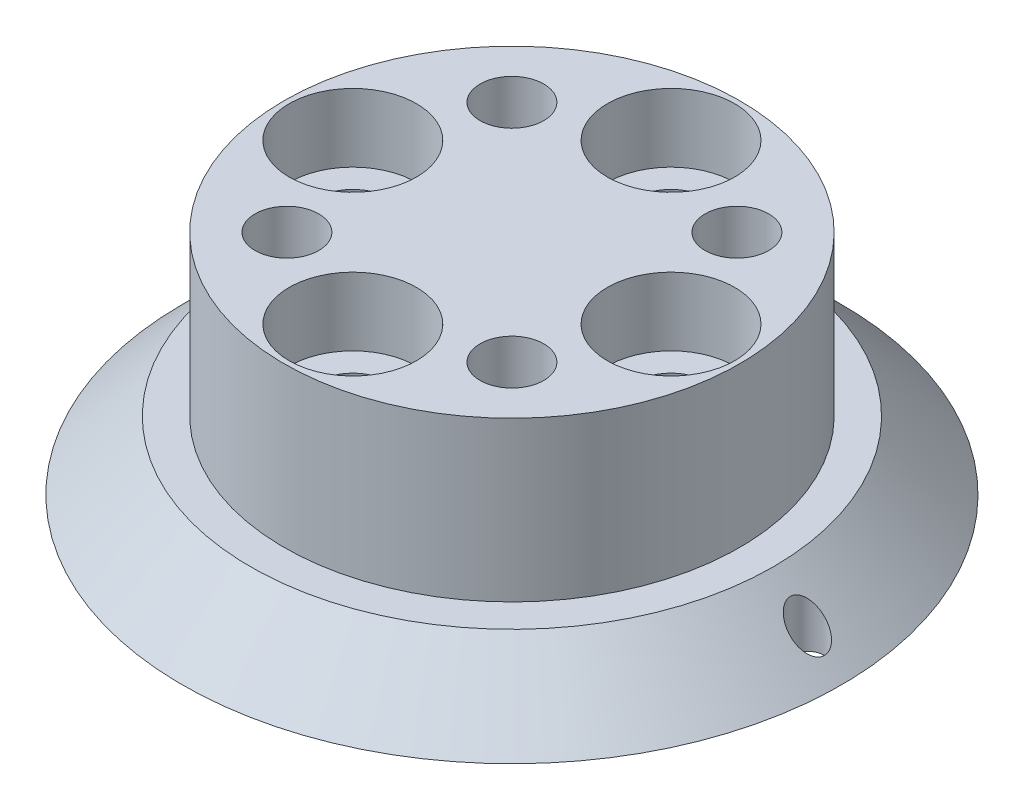
ISO-10303-21;
HEADER;
FILE_DESCRIPTION(('STEP AP214'),'2;1');
FILE_NAME('part.step','',(''),(''),'','','');
FILE_SCHEMA(('AUTOMOTIVE_DESIGN { 1 0 10303 214 1 1 1 1 }'));
ENDSEC;
DATA;
#1=APPLICATION_CONTEXT('core data for automotive mechanical design processes');
#2=APPLICATION_PROTOCOL_DEFINITION('international standard','automotive_design',2000,#1);
#3=PRODUCT_CONTEXT('',#1,'mechanical');
#4=PRODUCT('Part','Part','',(#3));
#5=PRODUCT_RELATED_PRODUCT_CATEGORY('part','',(#4));
#6=PRODUCT_DEFINITION_FORMATION('','',#4);
#7=PRODUCT_DEFINITION_CONTEXT('part definition',#1,'design');
#8=PRODUCT_DEFINITION('design','',#6,#7);
#9=PRODUCT_DEFINITION_SHAPE('','',#8);
#10=(LENGTH_UNIT() NAMED_UNIT(*) SI_UNIT(.MILLI.,.METRE.));
#11=(NAMED_UNIT(*) PLANE_ANGLE_UNIT() SI_UNIT($,.RADIAN.));
#12=(NAMED_UNIT(*) SI_UNIT($,.STERADIAN.) SOLID_ANGLE_UNIT());
#13=UNCERTAINTY_MEASURE_WITH_UNIT(LENGTH_MEASURE(1.E-05),#10,'distance_accuracy_value','');
#14=(GEOMETRIC_REPRESENTATION_CONTEXT(3) GLOBAL_UNCERTAINTY_ASSIGNED_CONTEXT((#13)) GLOBAL_UNIT_ASSIGNED_CONTEXT((#10,
#11,#12)) REPRESENTATION_CONTEXT('',''));
#15=CARTESIAN_POINT('',(0.,0.,0.));
#16=DIRECTION('',(0.,0.,1.));
#17=DIRECTION('',(1.,0.,0.));
#18=AXIS2_PLACEMENT_3D('',#15,#16,#17);
#19=CARTESIAN_POINT('',(0.,0.,0.));
#20=DIRECTION('',(0.,-1.,0.));
#21=DIRECTION('',(1.,0.,0.));
#22=AXIS2_PLACEMENT_3D('',#19,#20,#21);
#23=CONICAL_SURFACE('',#22,14.5,0.785398163397448);
#24=CARTESIAN_POINT('',(0.,3.,0.));
#25=DIRECTION('',(0.,1.,0.));
#26=DIRECTION('',(-1.,0.,0.));
#27=AXIS2_PLACEMENT_3D('',#24,#25,#26);
#28=CIRCLE('',#27,11.5);
#29=CARTESIAN_POINT('',(-11.5,3.,0.));
#30=VERTEX_POINT('',#29);
#31=EDGE_CURVE('E52',#30,#30,#28,.T.);
#32=ORIENTED_EDGE('',*,*,#31,.F.);
#33=EDGE_LOOP('',(#32));
#34=FACE_BOUND('',#33,.T.);
#35=CARTESIAN_POINT('',(0.,0.,0.));
#36=DIRECTION('',(0.,1.,0.));
#37=DIRECTION('',(-1.,0.,0.));
#38=AXIS2_PLACEMENT_3D('',#35,#36,#37);
#39=CIRCLE('',#38,14.5);
#40=CARTESIAN_POINT('',(-14.5,0.,0.));
#41=VERTEX_POINT('',#40);
#42=EDGE_CURVE('E10',#41,#41,#39,.T.);
#43=ORIENTED_EDGE('',*,*,#42,.T.);
#44=EDGE_LOOP('',(#43));
#45=FACE_BOUND('',#44,.T.);
#46=CARTESIAN_POINT('',(12.9948341608597,1.48354164212271,-0.749982209192976));
#47=CARTESIAN_POINT('',(12.9364935341536,1.54180922561021,-0.749583560756459));
#48=CARTESIAN_POINT('',(12.8783004941769,1.60032300226983,-0.742396161148481));
#49=CARTESIAN_POINT('',(12.7638365458904,1.71619736467733,-0.714289848122274));
#50=CARTESIAN_POINT('',(12.7075695409703,1.77355552163764,-0.693344607078417));
#51=CARTESIAN_POINT('',(12.6150955455572,1.86843105298747,-0.645141021105514));
#52=CARTESIAN_POINT('',(12.5778602982361,1.90681752631335,-0.621557567258396));
#53=CARTESIAN_POINT('',(12.5064901064853,1.9807110489241,-0.566544212082132));
#54=CARTESIAN_POINT('',(12.4723482257536,2.01622452020039,-0.535132489345172));
#55=CARTESIAN_POINT('',(12.4175658602599,2.07342393970432,-0.473771049948768));
#56=CARTESIAN_POINT('',(12.3958114770755,2.09620837855213,-0.445845053144497));
#57=CARTESIAN_POINT('',(12.3555956917519,2.13842926219778,-0.385428639563194));
#58=CARTESIAN_POINT('',(12.3371299376035,2.15787013052481,-0.352944358386047));
#59=CARTESIAN_POINT('',(12.3080993956197,2.18849042864441,-0.290999209487508));
#60=CARTESIAN_POINT('',(12.2966894632602,2.20054751962583,-0.262372822438794));
#61=CARTESIAN_POINT('',(12.2772535405381,2.22110761753119,-0.20277387183083));
#62=CARTESIAN_POINT('',(12.2692250052006,2.22961329734777,-0.171803093541556));
#63=CARTESIAN_POINT('',(12.2571011220467,2.24246468226432,-0.10799210400031));
#64=CARTESIAN_POINT('',(12.253035415884,2.24677903579229,-0.075139721345059));
#65=CARTESIAN_POINT('',(12.2493212253376,2.250720166486,-0.00891009643265465));
#66=CARTESIAN_POINT('',(12.2496704733824,2.25034935000936,0.0244668675958352));
#67=CARTESIAN_POINT('',(12.2544441442832,2.24528449682013,0.0866241621838291));
#68=CARTESIAN_POINT('',(12.2583882705096,2.24109999538888,0.115486387743772));
#69=CARTESIAN_POINT('',(12.269401034764,2.22942704096951,0.171908238249079));
#70=CARTESIAN_POINT('',(12.2764708128509,2.22193738245102,0.199467383841684));
#71=CARTESIAN_POINT('',(12.2956955969512,2.20159706546993,0.260263823595735));
#72=CARTESIAN_POINT('',(12.3087215905999,2.1878310717698,0.292918145290884));
#73=CARTESIAN_POINT('',(12.3382852534755,2.1566552265864,0.354700212425162));
#74=CARTESIAN_POINT('',(12.3548289691708,2.139239101791,0.383821748389245));
#75=CARTESIAN_POINT('',(12.3973109610119,2.09462831737477,0.448641474065824));
#76=CARTESIAN_POINT('',(12.4244458681322,2.06621570718072,0.482711355779163));
#77=CARTESIAN_POINT('',(12.4821947286028,2.0059823230508,0.544208911392021));
#78=CARTESIAN_POINT('',(12.5128150121732,1.97415535410635,0.571624206936969));
#79=CARTESIAN_POINT('',(12.5890303907577,1.89526320863927,0.629861953453657));
#80=CARTESIAN_POINT('',(12.6357657883682,1.84714175277602,0.657758271820858));
#81=CARTESIAN_POINT('',(12.7320017535624,1.74864772687644,0.702492486529439));
#82=CARTESIAN_POINT('',(12.7815050130463,1.69827297524969,0.719319406912173));
#83=CARTESIAN_POINT('',(12.8831897526105,1.59542178273262,0.742724299936907));
#84=CARTESIAN_POINT('',(12.9354068728255,1.54292380313453,0.749050848465239));
#85=CARTESIAN_POINT('',(13.0402496000027,1.43815737678019,0.750751602803753));
#86=CARTESIAN_POINT('',(13.0928751559745,1.38588890260797,0.746127154527306));
#87=CARTESIAN_POINT('',(13.19415891612,1.28587946082146,0.726157335679848));
#88=CARTESIAN_POINT('',(13.2428648640824,1.23805563919978,0.711475896782998));
#89=CARTESIAN_POINT('',(13.3382410027694,1.14489146078698,0.671389238050788));
#90=CARTESIAN_POINT('',(13.3849136371072,1.09954810523978,0.645997305490776));
#91=CARTESIAN_POINT('',(13.4616176730238,1.02537474030644,0.592398064994469));
#92=CARTESIAN_POINT('',(13.492620140706,0.995503368127729,0.567021893026735));
#93=CARTESIAN_POINT('',(13.5515215141515,0.938921336608146,0.509903460497264));
#94=CARTESIAN_POINT('',(13.5794248214808,0.912206191124143,0.478170412724067));
#95=CARTESIAN_POINT('',(13.624912500746,0.868764263544569,0.416070337253262));
#96=CARTESIAN_POINT('',(13.6434063856979,0.851142229083931,0.387000374067114));
#97=CARTESIAN_POINT('',(13.6767844829109,0.819387868123951,0.325106415936343));
#98=CARTESIAN_POINT('',(13.691673003496,0.805251376113521,0.292286971281323));
#99=CARTESIAN_POINT('',(13.7148932682379,0.7832282477634,0.228869975845452));
#100=CARTESIAN_POINT('',(13.7238885897199,0.774707727111714,0.198737533158631));
#101=CARTESIAN_POINT('',(13.738097437305,0.761256272979814,0.136817021476729));
#102=CARTESIAN_POINT('',(13.7433130921196,0.756323318973499,0.105029895230728));
#103=CARTESIAN_POINT('',(13.7496039476048,0.750374113506902,0.0405679119815987));
#104=CARTESIAN_POINT('',(13.7506649916144,0.749371253666974,0.00789040112642758));
#105=CARTESIAN_POINT('',(13.7485244097244,0.751395141202121,-0.0571969821317426));
#106=CARTESIAN_POINT('',(13.7453227168843,0.75442195185771,-0.0896068503237343));
#107=CARTESIAN_POINT('',(13.7351828385351,0.764015336874811,-0.151445325885998));
#108=CARTESIAN_POINT('',(13.7284548852159,0.770382766175314,-0.180940523882739));
#109=CARTESIAN_POINT('',(13.7118089609947,0.786153166714391,-0.238153802516811));
#110=CARTESIAN_POINT('',(13.7018897593155,0.795557309135305,-0.265871192547562));
#111=CARTESIAN_POINT('',(13.6755467056619,0.820565895022131,-0.328067124879033));
#112=CARTESIAN_POINT('',(13.658057185053,0.837191908107657,-0.361684211095385));
#113=CARTESIAN_POINT('',(13.6193867479272,0.874035959088365,-0.424532691005327));
#114=CARTESIAN_POINT('',(13.5981995799411,0.894260081310036,-0.453756498857077));
#115=CARTESIAN_POINT('',(13.545381996071,0.944806690936942,-0.516998891662958));
#116=CARTESIAN_POINT('',(13.512659875584,0.976215710286605,-0.549232597869107));
#117=CARTESIAN_POINT('',(13.444053665074,1.04232576490471,-0.606059237602858));
#118=CARTESIAN_POINT('',(13.4081631032902,1.07703354974343,-0.63063604523612));
#119=CARTESIAN_POINT('',(13.3218388951049,1.16086172466466,-0.679824988455356));
#120=CARTESIAN_POINT('',(13.270627549972,1.21085340517382,-0.701577736521775));
#121=CARTESIAN_POINT('',(13.1667896406572,1.31282332478809,-0.733227549377035));
#122=CARTESIAN_POINT('',(13.1141652302391,1.36479858642158,-0.743141714100687));
#123=CARTESIAN_POINT('',(13.0392912029387,1.43919734430488,-0.749301264230677));
#124=CARTESIAN_POINT('',(13.0170519795783,1.46135164040038,-0.75013402618904));
#125=CARTESIAN_POINT('',(12.9948341608597,1.48354164212271,-0.749982209192976));
#126=B_SPLINE_CURVE_WITH_KNOTS('',3,(#46,#47,#48,#49,#50,#51,#52,#53,#54,#55,#56,#57,#58,#59,
#60,#61,#62,#63,#64,#65,#66,#67,#68,#69,#70,#71,#72,#73,#74,#75,#76,#77,#78,#79,#80,#81,#82,#83,
#84,#85,#86,#87,#88,#89,#90,#91,#92,#93,#94,#95,#96,#97,#98,#99,#100,#101,#102,#103,#104,#105,
#106,#107,#108,#109,#110,#111,#112,#113,#114,#115,#116,#117,#118,#119,#120,#121,#122,#123,#124,
#125),.UNSPECIFIED.,.T.,.F.,(4,2,2,2,2,2,2,2,2,2,2,2,2,2,2,2,2,2,2,2,2,2,2,2,2,2,2,2,2,2,2,2,2,
2,2,2,2,2,2,4),(0.,0.247285800719263,0.495046202775016,0.669853176637426,0.844257940494709,
0.97015057263341,1.09587534629085,1.19476631073188,1.29358271228266,1.39313270656967,
1.4926315729049,1.58051970288338,1.66843991590453,1.78108751229377,1.89393032226417,
2.04908428552146,2.20452467992398,2.42131705975766,2.63832407925603,2.86045594301618,
3.08256050745977,3.29125946234822,3.49970026645828,3.64914298228231,3.79837066303312,
3.9140460048945,4.02958242772126,4.12690864510879,4.22418000559957,4.32178252718911,
4.41938658151202,4.51174093024112,4.60413094030013,4.72759527806749,4.85127041087299,
5.01729578273769,5.18366848668893,5.40690958394362,5.62982783481875,5.72400150764742),.UNSPECIFIED.);
#127=CARTESIAN_POINT('',(12.9948341608597,1.48354164212271,-0.749982209192976));
#128=VERTEX_POINT('',#127);
#129=EDGE_CURVE('E43',#128,#128,#126,.T.);
#130=ORIENTED_EDGE('',*,*,#129,.F.);
#131=EDGE_LOOP('',(#130));
#132=FACE_BOUND('',#131,.T.);
#133=ADVANCED_FACE('F39',(#34,#45,#132),#23,.T.);
#134=CARTESIAN_POINT('',(10.025,10.,0.));
#135=DIRECTION('',(0.,-1.,0.));
#136=DIRECTION('',(1.,0.,0.));
#137=AXIS2_PLACEMENT_3D('',#134,#135,#136);
#138=PLANE('',#137);
#139=CARTESIAN_POINT('',(0.,10.,-7.));
#140=DIRECTION('',(0.,1.,0.));
#141=DIRECTION('',(0.,0.,1.));
#142=AXIS2_PLACEMENT_3D('',#139,#140,#141);
#143=CIRCLE('',#142,2.8);
#144=CARTESIAN_POINT('',(0.,10.,-4.2));
#145=VERTEX_POINT('',#144);
#146=EDGE_CURVE('E144',#145,#145,#143,.T.);
#147=ORIENTED_EDGE('',*,*,#146,.F.);
#148=EDGE_LOOP('',(#147));
#149=FACE_BOUND('',#148,.T.);
#150=CARTESIAN_POINT('',(-7.,10.,0.));
#151=DIRECTION('',(0.,1.,0.));
#152=DIRECTION('',(0.,0.,1.));
#153=AXIS2_PLACEMENT_3D('',#150,#151,#152);
#154=CIRCLE('',#153,2.8);
#155=CARTESIAN_POINT('',(-7.,10.,2.79999999999993));
#156=VERTEX_POINT('',#155);
#157=EDGE_CURVE('E132',#156,#156,#154,.T.);
#158=ORIENTED_EDGE('',*,*,#157,.F.);
#159=EDGE_LOOP('',(#158));
#160=FACE_BOUND('',#159,.T.);
#161=CARTESIAN_POINT('',(0.,10.,7.));
#162=DIRECTION('',(0.,1.,0.));
#163=DIRECTION('',(0.,0.,1.));
#164=AXIS2_PLACEMENT_3D('',#161,#162,#163);
#165=CIRCLE('',#164,2.8);
#166=CARTESIAN_POINT('',(0.,10.,9.8));
#167=VERTEX_POINT('',#166);
#168=EDGE_CURVE('E120',#167,#167,#165,.T.);
#169=ORIENTED_EDGE('',*,*,#168,.F.);
#170=EDGE_LOOP('',(#169));
#171=FACE_BOUND('',#170,.T.);
#172=CARTESIAN_POINT('',(0.,10.,0.));
#173=DIRECTION('',(0.,1.,0.));
#174=DIRECTION('',(-1.,0.,0.));
#175=AXIS2_PLACEMENT_3D('',#172,#173,#174);
#176=CIRCLE('',#175,10.025);
#177=CARTESIAN_POINT('',(-10.025,10.,0.));
#178=VERTEX_POINT('',#177);
#179=EDGE_CURVE('E64',#178,#178,#176,.T.);
#180=ORIENTED_EDGE('',*,*,#179,.T.);
#181=EDGE_LOOP('',(#180));
#182=FACE_BOUND('',#181,.T.);
#183=CARTESIAN_POINT('',(4.94974746830581,10.,4.94974746830586));
#184=DIRECTION('',(0.,1.,0.));
#185=DIRECTION('',(-1.,0.,0.));
#186=AXIS2_PLACEMENT_3D('',#183,#184,#185);
#187=CIRCLE('',#186,1.4);
#188=CARTESIAN_POINT('',(3.54974746830581,10.,4.94974746830586));
#189=VERTEX_POINT('',#188);
#190=EDGE_CURVE('E86',#189,#189,#187,.T.);
#191=ORIENTED_EDGE('',*,*,#190,.F.);
#192=EDGE_LOOP('',(#191));
#193=FACE_BOUND('',#192,.T.);
#194=CARTESIAN_POINT('',(4.94974746830591,10.,-4.94974746830576));
#195=DIRECTION('',(0.,1.,0.));
#196=DIRECTION('',(-1.,0.,0.));
#197=AXIS2_PLACEMENT_3D('',#194,#195,#196);
#198=CIRCLE('',#197,1.4);
#199=CARTESIAN_POINT('',(3.54974746830591,10.,-4.94974746830576));
#200=VERTEX_POINT('',#199);
#201=EDGE_CURVE('E68',#200,#200,#198,.T.);
#202=ORIENTED_EDGE('',*,*,#201,.F.);
#203=EDGE_LOOP('',(#202));
#204=FACE_BOUND('',#203,.T.);
#205=CARTESIAN_POINT('',(-4.94974746830588,10.,4.94974746830579));
#206=DIRECTION('',(0.,1.,0.));
#207=DIRECTION('',(-1.,0.,0.));
#208=AXIS2_PLACEMENT_3D('',#205,#206,#207);
#209=CIRCLE('',#208,1.4);
#210=CARTESIAN_POINT('',(-6.34974746830588,10.,4.94974746830579));
#211=VERTEX_POINT('',#210);
#212=EDGE_CURVE('E79',#211,#211,#209,.T.);
#213=ORIENTED_EDGE('',*,*,#212,.F.);
#214=EDGE_LOOP('',(#213));
#215=FACE_BOUND('',#214,.T.);
#216=CARTESIAN_POINT('',(-4.94974746830577,10.,-4.94974746830589));
#217=DIRECTION('',(0.,1.,0.));
#218=DIRECTION('',(-1.,0.,0.));
#219=AXIS2_PLACEMENT_3D('',#216,#217,#218);
#220=CIRCLE('',#219,1.4);
#221=CARTESIAN_POINT('',(-6.34974746830577,10.,-4.94974746830589));
#222=VERTEX_POINT('',#221);
#223=EDGE_CURVE('E72',#222,#222,#220,.T.);
#224=ORIENTED_EDGE('',*,*,#223,.F.);
#225=EDGE_LOOP('',(#224));
#226=FACE_BOUND('',#225,.T.);
#227=CARTESIAN_POINT('',(7.,10.,1.21843208143388E-13));
#228=DIRECTION('',(0.,1.,0.));
#229=DIRECTION('',(0.,0.,1.));
#230=AXIS2_PLACEMENT_3D('',#227,#228,#229);
#231=CIRCLE('',#230,2.8);
#232=CARTESIAN_POINT('',(7.,10.,2.80000000000012));
#233=VERTEX_POINT('',#232);
#234=EDGE_CURVE('E107',#233,#233,#231,.T.);
#235=ORIENTED_EDGE('',*,*,#234,.F.);
#236=EDGE_LOOP('',(#235));
#237=FACE_BOUND('',#236,.T.);
#238=ADVANCED_FACE('F158',(#149,#160,#171,#182,#193,#204,#215,#226,#237),#138,.F.);
#239=CARTESIAN_POINT('',(14.5,0.,0.));
#240=DIRECTION('',(0.,1.,0.));
#241=DIRECTION('',(-1.,0.,0.));
#242=AXIS2_PLACEMENT_3D('',#239,#240,#241);
#243=PLANE('',#242);
#244=CARTESIAN_POINT('',(13.,0.,0.));
#245=DIRECTION('',(0.,1.,0.));
#246=DIRECTION('',(0.,0.,1.));
#247=AXIS2_PLACEMENT_3D('',#244,#245,#246);
#248=CIRCLE('',#247,0.75);
#249=CARTESIAN_POINT('',(13.,0.,0.75));
#250=VERTEX_POINT('',#249);
#251=EDGE_CURVE('E147',#250,#250,#248,.T.);
#252=ORIENTED_EDGE('',*,*,#251,.T.);
#253=EDGE_LOOP('',(#252));
#254=FACE_BOUND('',#253,.T.);
#255=CARTESIAN_POINT('',(0.,0.,-7.));
#256=DIRECTION('',(0.,1.,0.));
#257=DIRECTION('',(0.,0.,1.));
#258=AXIS2_PLACEMENT_3D('',#255,#256,#257);
#259=CIRCLE('',#258,1.6);
#260=CARTESIAN_POINT('',(0.,0.,-5.4));
#261=VERTEX_POINT('',#260);
#262=EDGE_CURVE('E135',#261,#261,#259,.T.);
#263=ORIENTED_EDGE('',*,*,#262,.T.);
#264=EDGE_LOOP('',(#263));
#265=FACE_BOUND('',#264,.T.);
#266=CARTESIAN_POINT('',(-7.,0.,0.));
#267=DIRECTION('',(0.,1.,0.));
#268=DIRECTION('',(0.,0.,1.));
#269=AXIS2_PLACEMENT_3D('',#266,#267,#268);
#270=CIRCLE('',#269,1.6);
#271=CARTESIAN_POINT('',(-7.,0.,1.59999999999993));
#272=VERTEX_POINT('',#271);
#273=EDGE_CURVE('E123',#272,#272,#270,.T.);
#274=ORIENTED_EDGE('',*,*,#273,.T.);
#275=EDGE_LOOP('',(#274));
#276=FACE_BOUND('',#275,.T.);
#277=CARTESIAN_POINT('',(0.,0.,7.));
#278=DIRECTION('',(0.,1.,0.));
#279=DIRECTION('',(0.,0.,1.));
#280=AXIS2_PLACEMENT_3D('',#277,#278,#279);
#281=CIRCLE('',#280,1.6);
#282=CARTESIAN_POINT('',(0.,0.,8.6));
#283=VERTEX_POINT('',#282);
#284=EDGE_CURVE('E111',#283,#283,#281,.T.);
#285=ORIENTED_EDGE('',*,*,#284,.T.);
#286=EDGE_LOOP('',(#285));
#287=FACE_BOUND('',#286,.T.);
#288=CARTESIAN_POINT('',(7.,0.,1.21843208143388E-13));
#289=DIRECTION('',(0.,1.,0.));
#290=DIRECTION('',(0.,0.,1.));
#291=AXIS2_PLACEMENT_3D('',#288,#289,#290);
#292=CIRCLE('',#291,1.6);
#293=CARTESIAN_POINT('',(7.,0.,1.60000000000012));
#294=VERTEX_POINT('',#293);
#295=EDGE_CURVE('E73',#294,#294,#292,.T.);
#296=ORIENTED_EDGE('',*,*,#295,.T.);
#297=EDGE_LOOP('',(#296));
#298=FACE_BOUND('',#297,.T.);
#299=CARTESIAN_POINT('',(-4.94974746830577,0.,-4.94974746830589));
#300=DIRECTION('',(0.,1.,0.));
#301=DIRECTION('',(-1.,0.,0.));
#302=AXIS2_PLACEMENT_3D('',#299,#300,#301);
#303=CIRCLE('',#302,1.4);
#304=CARTESIAN_POINT('',(-6.34974746830577,0.,-4.94974746830589));
#305=VERTEX_POINT('',#304);
#306=EDGE_CURVE('E69',#305,#305,#303,.T.);
#307=ORIENTED_EDGE('',*,*,#306,.T.);
#308=EDGE_LOOP('',(#307));
#309=FACE_BOUND('',#308,.T.);
#310=CARTESIAN_POINT('',(-4.94974746830588,0.,4.94974746830579));
#311=DIRECTION('',(0.,1.,0.));
#312=DIRECTION('',(-1.,0.,0.));
#313=AXIS2_PLACEMENT_3D('',#310,#311,#312);
#314=CIRCLE('',#313,1.4);
#315=CARTESIAN_POINT('',(-6.34974746830588,0.,4.94974746830579));
#316=VERTEX_POINT('',#315);
#317=EDGE_CURVE('E76',#316,#316,#314,.T.);
#318=ORIENTED_EDGE('',*,*,#317,.T.);
#319=EDGE_LOOP('',(#318));
#320=FACE_BOUND('',#319,.T.);
#321=CARTESIAN_POINT('',(4.94974746830591,0.,-4.94974746830576));
#322=DIRECTION('',(0.,1.,0.));
#323=DIRECTION('',(-1.,0.,0.));
#324=AXIS2_PLACEMENT_3D('',#321,#322,#323);
#325=CIRCLE('',#324,1.4);
#326=CARTESIAN_POINT('',(3.54974746830591,0.,-4.94974746830576));
#327=VERTEX_POINT('',#326);
#328=EDGE_CURVE('E83',#327,#327,#325,.T.);
#329=ORIENTED_EDGE('',*,*,#328,.T.);
#330=EDGE_LOOP('',(#329));
#331=FACE_BOUND('',#330,.T.);
#332=CARTESIAN_POINT('',(4.94974746830581,0.,4.94974746830586));
#333=DIRECTION('',(0.,1.,0.));
#334=DIRECTION('',(-1.,0.,0.));
#335=AXIS2_PLACEMENT_3D('',#332,#333,#334);
#336=CIRCLE('',#335,1.4);
#337=CARTESIAN_POINT('',(3.54974746830581,0.,4.94974746830586));
#338=VERTEX_POINT('',#337);
#339=EDGE_CURVE('E82',#338,#338,#336,.T.);
#340=ORIENTED_EDGE('',*,*,#339,.T.);
#341=EDGE_LOOP('',(#340));
#342=FACE_BOUND('',#341,.T.);
#343=ORIENTED_EDGE('',*,*,#42,.F.);
#344=EDGE_LOOP('',(#343));
#345=FACE_BOUND('',#344,.T.);
#346=ADVANCED_FACE('F41',(#254,#265,#276,#287,#298,#309,#320,#331,#342,#345),#243,.F.);
#347=CARTESIAN_POINT('',(11.5,3.,0.));
#348=DIRECTION('',(0.,-1.,0.));
#349=DIRECTION('',(1.,0.,0.));
#350=AXIS2_PLACEMENT_3D('',#347,#348,#349);
#351=PLANE('',#350);
#352=CARTESIAN_POINT('',(0.,3.,0.));
#353=DIRECTION('',(0.,1.,0.));
#354=DIRECTION('',(-1.,0.,0.));
#355=AXIS2_PLACEMENT_3D('',#352,#353,#354);
#356=CIRCLE('',#355,10.025);
#357=CARTESIAN_POINT('',(-10.025,3.,0.));
#358=VERTEX_POINT('',#357);
#359=EDGE_CURVE('E58',#358,#358,#356,.T.);
#360=ORIENTED_EDGE('',*,*,#359,.F.);
#361=EDGE_LOOP('',(#360));
#362=FACE_BOUND('',#361,.T.);
#363=ORIENTED_EDGE('',*,*,#31,.T.);
#364=EDGE_LOOP('',(#363));
#365=FACE_BOUND('',#364,.T.);
#366=ADVANCED_FACE('F170',(#362,#365),#351,.F.);
#367=CARTESIAN_POINT('',(0.,10.,0.));
#368=DIRECTION('',(0.,1.,0.));
#369=DIRECTION('',(-1.,0.,0.));
#370=AXIS2_PLACEMENT_3D('',#367,#368,#369);
#371=CYLINDRICAL_SURFACE('',#370,10.025);
#372=ORIENTED_EDGE('',*,*,#179,.F.);
#373=EDGE_LOOP('',(#372));
#374=FACE_BOUND('',#373,.T.);
#375=ORIENTED_EDGE('',*,*,#359,.T.);
#376=EDGE_LOOP('',(#375));
#377=FACE_BOUND('',#376,.T.);
#378=ADVANCED_FACE('F173',(#374,#377),#371,.T.);
#379=CARTESIAN_POINT('',(4.94974746830581,0.,4.94974746830586));
#380=DIRECTION('',(0.,1.,0.));
#381=DIRECTION('',(-1.,0.,0.));
#382=AXIS2_PLACEMENT_3D('',#379,#380,#381);
#383=CYLINDRICAL_SURFACE('',#382,1.4);
#384=ORIENTED_EDGE('',*,*,#339,.F.);
#385=EDGE_LOOP('',(#384));
#386=FACE_BOUND('',#385,.T.);
#387=ORIENTED_EDGE('',*,*,#190,.T.);
#388=EDGE_LOOP('',(#387));
#389=FACE_BOUND('',#388,.T.);
#390=ADVANCED_FACE('F176',(#386,#389),#383,.F.);
#391=CARTESIAN_POINT('',(4.94974746830591,0.,-4.94974746830576));
#392=DIRECTION('',(0.,1.,0.));
#393=DIRECTION('',(-1.,0.,0.));
#394=AXIS2_PLACEMENT_3D('',#391,#392,#393);
#395=CYLINDRICAL_SURFACE('',#394,1.4);
#396=ORIENTED_EDGE('',*,*,#328,.F.);
#397=EDGE_LOOP('',(#396));
#398=FACE_BOUND('',#397,.T.);
#399=ORIENTED_EDGE('',*,*,#201,.T.);
#400=EDGE_LOOP('',(#399));
#401=FACE_BOUND('',#400,.T.);
#402=ADVANCED_FACE('F187',(#398,#401),#395,.F.);
#403=CARTESIAN_POINT('',(-4.94974746830588,0.,4.94974746830579));
#404=DIRECTION('',(0.,1.,0.));
#405=DIRECTION('',(-1.,0.,0.));
#406=AXIS2_PLACEMENT_3D('',#403,#404,#405);
#407=CYLINDRICAL_SURFACE('',#406,1.4);
#408=ORIENTED_EDGE('',*,*,#317,.F.);
#409=EDGE_LOOP('',(#408));
#410=FACE_BOUND('',#409,.T.);
#411=ORIENTED_EDGE('',*,*,#212,.T.);
#412=EDGE_LOOP('',(#411));
#413=FACE_BOUND('',#412,.T.);
#414=ADVANCED_FACE('F183',(#410,#413),#407,.F.);
#415=CARTESIAN_POINT('',(-4.94974746830577,0.,-4.94974746830589));
#416=DIRECTION('',(0.,1.,0.));
#417=DIRECTION('',(-1.,0.,0.));
#418=AXIS2_PLACEMENT_3D('',#415,#416,#417);
#419=CYLINDRICAL_SURFACE('',#418,1.4);
#420=ORIENTED_EDGE('',*,*,#306,.F.);
#421=EDGE_LOOP('',(#420));
#422=FACE_BOUND('',#421,.T.);
#423=ORIENTED_EDGE('',*,*,#223,.T.);
#424=EDGE_LOOP('',(#423));
#425=FACE_BOUND('',#424,.T.);
#426=ADVANCED_FACE('F179',(#422,#425),#419,.F.);
#427=CARTESIAN_POINT('',(7.,10.,1.21843208143388E-13));
#428=DIRECTION('',(0.,1.,0.));
#429=DIRECTION('',(0.,0.,1.));
#430=AXIS2_PLACEMENT_3D('',#427,#428,#429);
#431=CYLINDRICAL_SURFACE('',#430,1.6);
#432=ORIENTED_EDGE('',*,*,#295,.F.);
#433=EDGE_LOOP('',(#432));
#434=FACE_BOUND('',#433,.T.);
#435=CARTESIAN_POINT('',(7.,7.,1.21843208143388E-13));
#436=DIRECTION('',(0.,1.,0.));
#437=DIRECTION('',(0.,0.,1.));
#438=AXIS2_PLACEMENT_3D('',#435,#436,#437);
#439=CIRCLE('',#438,1.6);
#440=CARTESIAN_POINT('',(7.,7.,1.60000000000012));
#441=VERTEX_POINT('',#440);
#442=EDGE_CURVE('E99',#441,#441,#439,.T.);
#443=ORIENTED_EDGE('',*,*,#442,.T.);
#444=EDGE_LOOP('',(#443));
#445=FACE_BOUND('',#444,.T.);
#446=ADVANCED_FACE('F182',(#434,#445),#431,.F.);
#447=CARTESIAN_POINT('',(8.6,7.,1.21843208143388E-13));
#448=DIRECTION('',(0.,-1.,0.));
#449=DIRECTION('',(0.,0.,-1.));
#450=AXIS2_PLACEMENT_3D('',#447,#448,#449);
#451=PLANE('',#450);
#452=ORIENTED_EDGE('',*,*,#442,.F.);
#453=EDGE_LOOP('',(#452));
#454=FACE_BOUND('',#453,.T.);
#455=CARTESIAN_POINT('',(7.,7.,1.21843208143388E-13));
#456=DIRECTION('',(0.,1.,0.));
#457=DIRECTION('',(0.,0.,1.));
#458=AXIS2_PLACEMENT_3D('',#455,#456,#457);
#459=CIRCLE('',#458,2.8);
#460=CARTESIAN_POINT('',(7.,7.,2.80000000000012));
#461=VERTEX_POINT('',#460);
#462=EDGE_CURVE('E103',#461,#461,#459,.T.);
#463=ORIENTED_EDGE('',*,*,#462,.T.);
#464=EDGE_LOOP('',(#463));
#465=FACE_BOUND('',#464,.T.);
#466=ADVANCED_FACE('F197',(#454,#465),#451,.F.);
#467=CARTESIAN_POINT('',(7.,10.,1.21843208143388E-13));
#468=DIRECTION('',(0.,1.,0.));
#469=DIRECTION('',(0.,0.,1.));
#470=AXIS2_PLACEMENT_3D('',#467,#468,#469);
#471=CYLINDRICAL_SURFACE('',#470,2.8);
#472=ORIENTED_EDGE('',*,*,#462,.F.);
#473=EDGE_LOOP('',(#472));
#474=FACE_BOUND('',#473,.T.);
#475=ORIENTED_EDGE('',*,*,#234,.T.);
#476=EDGE_LOOP('',(#475));
#477=FACE_BOUND('',#476,.T.);
#478=ADVANCED_FACE('F201',(#474,#477),#471,.F.);
#479=CARTESIAN_POINT('',(0.,10.,7.));
#480=DIRECTION('',(0.,1.,0.));
#481=DIRECTION('',(0.,0.,1.));
#482=AXIS2_PLACEMENT_3D('',#479,#480,#481);
#483=CYLINDRICAL_SURFACE('',#482,1.6);
#484=ORIENTED_EDGE('',*,*,#284,.F.);
#485=EDGE_LOOP('',(#484));
#486=FACE_BOUND('',#485,.T.);
#487=CARTESIAN_POINT('',(0.,7.,7.));
#488=DIRECTION('',(0.,1.,0.));
#489=DIRECTION('',(0.,0.,1.));
#490=AXIS2_PLACEMENT_3D('',#487,#488,#489);
#491=CIRCLE('',#490,1.6);
#492=CARTESIAN_POINT('',(0.,7.,8.6));
#493=VERTEX_POINT('',#492);
#494=EDGE_CURVE('E114',#493,#493,#491,.T.);
#495=ORIENTED_EDGE('',*,*,#494,.T.);
#496=EDGE_LOOP('',(#495));
#497=FACE_BOUND('',#496,.T.);
#498=ADVANCED_FACE('F205',(#486,#497),#483,.F.);
#499=CARTESIAN_POINT('',(1.59999999999995,7.,7.));
#500=DIRECTION('',(0.,-1.,0.));
#501=DIRECTION('',(0.,0.,-1.));
#502=AXIS2_PLACEMENT_3D('',#499,#500,#501);
#503=PLANE('',#502);
#504=ORIENTED_EDGE('',*,*,#494,.F.);
#505=EDGE_LOOP('',(#504));
#506=FACE_BOUND('',#505,.T.);
#507=CARTESIAN_POINT('',(0.,7.,7.));
#508=DIRECTION('',(0.,1.,0.));
#509=DIRECTION('',(0.,0.,1.));
#510=AXIS2_PLACEMENT_3D('',#507,#508,#509);
#511=CIRCLE('',#510,2.8);
#512=CARTESIAN_POINT('',(0.,7.,9.8));
#513=VERTEX_POINT('',#512);
#514=EDGE_CURVE('E117',#513,#513,#511,.T.);
#515=ORIENTED_EDGE('',*,*,#514,.T.);
#516=EDGE_LOOP('',(#515));
#517=FACE_BOUND('',#516,.T.);
#518=ADVANCED_FACE('F209',(#506,#517),#503,.F.);
#519=CARTESIAN_POINT('',(0.,10.,7.));
#520=DIRECTION('',(0.,1.,0.));
#521=DIRECTION('',(0.,0.,1.));
#522=AXIS2_PLACEMENT_3D('',#519,#520,#521);
#523=CYLINDRICAL_SURFACE('',#522,2.8);
#524=ORIENTED_EDGE('',*,*,#514,.F.);
#525=EDGE_LOOP('',(#524));
#526=FACE_BOUND('',#525,.T.);
#527=ORIENTED_EDGE('',*,*,#168,.T.);
#528=EDGE_LOOP('',(#527));
#529=FACE_BOUND('',#528,.T.);
#530=ADVANCED_FACE('F213',(#526,#529),#523,.F.);
#531=CARTESIAN_POINT('',(-7.,10.,0.));
#532=DIRECTION('',(0.,1.,0.));
#533=DIRECTION('',(0.,0.,1.));
#534=AXIS2_PLACEMENT_3D('',#531,#532,#533);
#535=CYLINDRICAL_SURFACE('',#534,1.6);
#536=ORIENTED_EDGE('',*,*,#273,.F.);
#537=EDGE_LOOP('',(#536));
#538=FACE_BOUND('',#537,.T.);
#539=CARTESIAN_POINT('',(-7.,7.,0.));
#540=DIRECTION('',(0.,1.,0.));
#541=DIRECTION('',(0.,0.,1.));
#542=AXIS2_PLACEMENT_3D('',#539,#540,#541);
#543=CIRCLE('',#542,1.6);
#544=CARTESIAN_POINT('',(-7.,7.,1.59999999999993));
#545=VERTEX_POINT('',#544);
#546=EDGE_CURVE('E126',#545,#545,#543,.T.);
#547=ORIENTED_EDGE('',*,*,#546,.T.);
#548=EDGE_LOOP('',(#547));
#549=FACE_BOUND('',#548,.T.);
#550=ADVANCED_FACE('F217',(#538,#549),#535,.F.);
#551=CARTESIAN_POINT('',(-5.4,7.,0.));
#552=DIRECTION('',(0.,-1.,0.));
#553=DIRECTION('',(0.,0.,-1.));
#554=AXIS2_PLACEMENT_3D('',#551,#552,#553);
#555=PLANE('',#554);
#556=ORIENTED_EDGE('',*,*,#546,.F.);
#557=EDGE_LOOP('',(#556));
#558=FACE_BOUND('',#557,.T.);
#559=CARTESIAN_POINT('',(-7.,7.,0.));
#560=DIRECTION('',(0.,1.,0.));
#561=DIRECTION('',(0.,0.,1.));
#562=AXIS2_PLACEMENT_3D('',#559,#560,#561);
#563=CIRCLE('',#562,2.8);
#564=CARTESIAN_POINT('',(-7.,7.,2.79999999999993));
#565=VERTEX_POINT('',#564);
#566=EDGE_CURVE('E129',#565,#565,#563,.T.);
#567=ORIENTED_EDGE('',*,*,#566,.T.);
#568=EDGE_LOOP('',(#567));
#569=FACE_BOUND('',#568,.T.);
#570=ADVANCED_FACE('F221',(#558,#569),#555,.F.);
#571=CARTESIAN_POINT('',(-7.,10.,0.));
#572=DIRECTION('',(0.,1.,0.));
#573=DIRECTION('',(0.,0.,1.));
#574=AXIS2_PLACEMENT_3D('',#571,#572,#573);
#575=CYLINDRICAL_SURFACE('',#574,2.8);
#576=ORIENTED_EDGE('',*,*,#566,.F.);
#577=EDGE_LOOP('',(#576));
#578=FACE_BOUND('',#577,.T.);
#579=ORIENTED_EDGE('',*,*,#157,.T.);
#580=EDGE_LOOP('',(#579));
#581=FACE_BOUND('',#580,.T.);
#582=ADVANCED_FACE('F225',(#578,#581),#575,.F.);
#583=CARTESIAN_POINT('',(0.,10.,-7.));
#584=DIRECTION('',(0.,1.,0.));
#585=DIRECTION('',(0.,0.,1.));
#586=AXIS2_PLACEMENT_3D('',#583,#584,#585);
#587=CYLINDRICAL_SURFACE('',#586,1.6);
#588=ORIENTED_EDGE('',*,*,#262,.F.);
#589=EDGE_LOOP('',(#588));
#590=FACE_BOUND('',#589,.T.);
#591=CARTESIAN_POINT('',(0.,7.,-7.));
#592=DIRECTION('',(0.,1.,0.));
#593=DIRECTION('',(0.,0.,1.));
#594=AXIS2_PLACEMENT_3D('',#591,#592,#593);
#595=CIRCLE('',#594,1.6);
#596=CARTESIAN_POINT('',(0.,7.,-5.4));
#597=VERTEX_POINT('',#596);
#598=EDGE_CURVE('E138',#597,#597,#595,.T.);
#599=ORIENTED_EDGE('',*,*,#598,.T.);
#600=EDGE_LOOP('',(#599));
#601=FACE_BOUND('',#600,.T.);
#602=ADVANCED_FACE('F229',(#590,#601),#587,.F.);
#603=CARTESIAN_POINT('',(1.6,7.,-7.));
#604=DIRECTION('',(0.,-1.,0.));
#605=DIRECTION('',(0.,0.,-1.));
#606=AXIS2_PLACEMENT_3D('',#603,#604,#605);
#607=PLANE('',#606);
#608=ORIENTED_EDGE('',*,*,#598,.F.);
#609=EDGE_LOOP('',(#608));
#610=FACE_BOUND('',#609,.T.);
#611=CARTESIAN_POINT('',(0.,7.,-7.));
#612=DIRECTION('',(0.,1.,0.));
#613=DIRECTION('',(0.,0.,1.));
#614=AXIS2_PLACEMENT_3D('',#611,#612,#613);
#615=CIRCLE('',#614,2.8);
#616=CARTESIAN_POINT('',(0.,7.,-4.2));
#617=VERTEX_POINT('',#616);
#618=EDGE_CURVE('E141',#617,#617,#615,.T.);
#619=ORIENTED_EDGE('',*,*,#618,.T.);
#620=EDGE_LOOP('',(#619));
#621=FACE_BOUND('',#620,.T.);
#622=ADVANCED_FACE('F233',(#610,#621),#607,.F.);
#623=CARTESIAN_POINT('',(0.,10.,-7.));
#624=DIRECTION('',(0.,1.,0.));
#625=DIRECTION('',(0.,0.,1.));
#626=AXIS2_PLACEMENT_3D('',#623,#624,#625);
#627=CYLINDRICAL_SURFACE('',#626,2.8);
#628=ORIENTED_EDGE('',*,*,#618,.F.);
#629=EDGE_LOOP('',(#628));
#630=FACE_BOUND('',#629,.T.);
#631=ORIENTED_EDGE('',*,*,#146,.T.);
#632=EDGE_LOOP('',(#631));
#633=FACE_BOUND('',#632,.T.);
#634=ADVANCED_FACE('F237',(#630,#633),#627,.F.);
#635=CARTESIAN_POINT('',(13.,10.,0.));
#636=DIRECTION('',(0.,-1.,0.));
#637=DIRECTION('',(0.,0.,-1.));
#638=AXIS2_PLACEMENT_3D('',#635,#636,#637);
#639=CYLINDRICAL_SURFACE('',#638,0.75);
#640=ORIENTED_EDGE('',*,*,#251,.F.);
#641=EDGE_LOOP('',(#640));
#642=FACE_BOUND('',#641,.T.);
#643=ORIENTED_EDGE('',*,*,#129,.T.);
#644=EDGE_LOOP('',(#643));
#645=FACE_BOUND('',#644,.T.);
#646=ADVANCED_FACE('F155',(#642,#645),#639,.F.);
#647=CLOSED_SHELL('',(#133,#238,#346,#366,#378,#390,#402,#414,#426,#446,#466,#478,#498,#518,
#530,#550,#570,#582,#602,#622,#634,#646));
#648=MANIFOLD_SOLID_BREP('B2',#647);
#649=ADVANCED_BREP_SHAPE_REPRESENTATION('',(#18,#648),#14);
#650=SHAPE_DEFINITION_REPRESENTATION(#9,#649);
ENDSEC;
END-ISO-10303-21;
